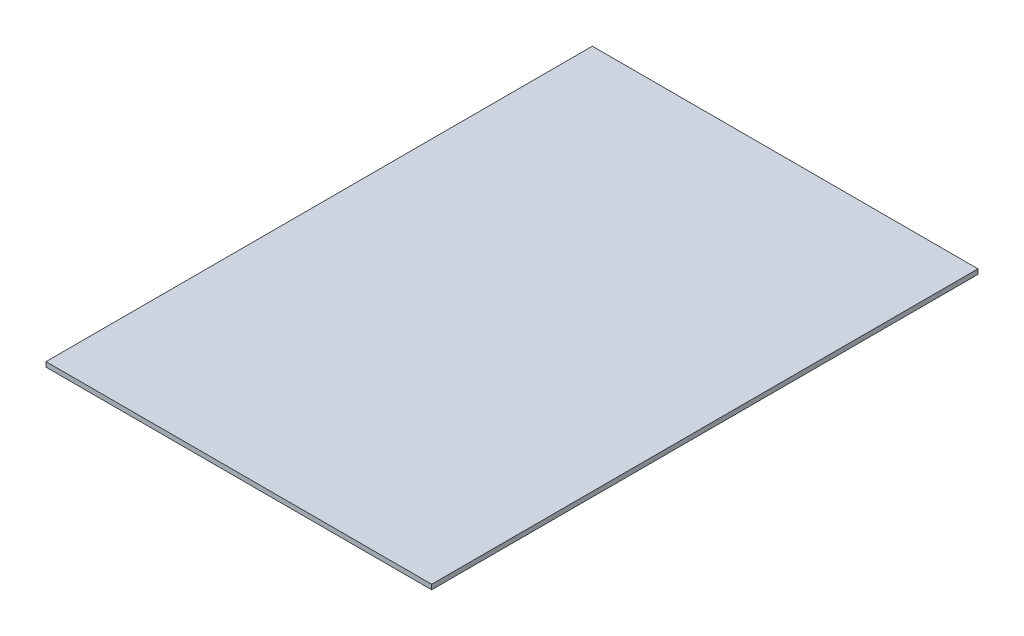
ISO-10303-21;
HEADER;
FILE_DESCRIPTION(('STEP AP214'),'2;1');
FILE_NAME('part.step','',(''),(''),'','','');
FILE_SCHEMA(('AUTOMOTIVE_DESIGN { 1 0 10303 214 1 1 1 1 }'));
ENDSEC;
DATA;
#1=APPLICATION_CONTEXT('core data for automotive mechanical design processes');
#2=APPLICATION_PROTOCOL_DEFINITION('international standard','automotive_design',2000,#1);
#3=PRODUCT_CONTEXT('',#1,'mechanical');
#4=PRODUCT('Part','Part','',(#3));
#5=PRODUCT_RELATED_PRODUCT_CATEGORY('part','',(#4));
#6=PRODUCT_DEFINITION_FORMATION('','',#4);
#7=PRODUCT_DEFINITION_CONTEXT('part definition',#1,'design');
#8=PRODUCT_DEFINITION('design','',#6,#7);
#9=PRODUCT_DEFINITION_SHAPE('','',#8);
#10=(LENGTH_UNIT() NAMED_UNIT(*) SI_UNIT(.MILLI.,.METRE.));
#11=(NAMED_UNIT(*) PLANE_ANGLE_UNIT() SI_UNIT($,.RADIAN.));
#12=(NAMED_UNIT(*) SI_UNIT($,.STERADIAN.) SOLID_ANGLE_UNIT());
#13=UNCERTAINTY_MEASURE_WITH_UNIT(LENGTH_MEASURE(1.E-05),#10,'distance_accuracy_value','');
#14=(GEOMETRIC_REPRESENTATION_CONTEXT(3) GLOBAL_UNCERTAINTY_ASSIGNED_CONTEXT((#13)) GLOBAL_UNIT_ASSIGNED_CONTEXT((#10,
#11,#12)) REPRESENTATION_CONTEXT('',''));
#15=CARTESIAN_POINT('',(0.,0.,0.));
#16=DIRECTION('',(0.,0.,1.));
#17=DIRECTION('',(1.,0.,0.));
#18=AXIS2_PLACEMENT_3D('',#15,#16,#17);
#19=CARTESIAN_POINT('',(152.4,1.905,-215.9));
#20=DIRECTION('',(-1.,0.,0.));
#21=DIRECTION('',(0.,0.,1.));
#22=AXIS2_PLACEMENT_3D('',#19,#20,#21);
#23=PLANE('',#22);
#24=DIRECTION('',(0.,0.,-1.));
#25=VECTOR('',#24,1.);
#26=CARTESIAN_POINT('',(152.4,0.,-215.9));
#27=LINE('',#26,#25);
#28=CARTESIAN_POINT('',(152.4,0.,0.));
#29=VERTEX_POINT('',#28);
#30=CARTESIAN_POINT('',(152.4,0.,-215.9));
#31=VERTEX_POINT('',#30);
#32=EDGE_CURVE('E111',#29,#31,#27,.T.);
#33=ORIENTED_EDGE('',*,*,#32,.T.);
#34=DIRECTION('',(0.,-1.,0.));
#35=VECTOR('',#34,1.);
#36=CARTESIAN_POINT('',(152.4,1.905,-215.9));
#37=LINE('',#36,#35);
#38=CARTESIAN_POINT('',(152.4,1.905,-215.9));
#39=VERTEX_POINT('',#38);
#40=EDGE_CURVE('E11',#39,#31,#37,.T.);
#41=ORIENTED_EDGE('',*,*,#40,.F.);
#42=DIRECTION('',(0.,0.,-1.));
#43=VECTOR('',#42,1.);
#44=CARTESIAN_POINT('',(152.4,1.905,-215.9));
#45=LINE('',#44,#43);
#46=CARTESIAN_POINT('',(152.4,1.905,0.));
#47=VERTEX_POINT('',#46);
#48=EDGE_CURVE('E95',#47,#39,#45,.T.);
#49=ORIENTED_EDGE('',*,*,#48,.F.);
#50=DIRECTION('',(0.,-1.,0.));
#51=VECTOR('',#50,1.);
#52=CARTESIAN_POINT('',(152.4,1.905,0.));
#53=LINE('',#52,#51);
#54=EDGE_CURVE('E107',#47,#29,#53,.T.);
#55=ORIENTED_EDGE('',*,*,#54,.T.);
#56=EDGE_LOOP('',(#33,#41,#49,#55));
#57=FACE_BOUND('',#56,.T.);
#58=ADVANCED_FACE('F43',(#57),#23,.F.);
#59=CARTESIAN_POINT('',(152.4,1.905,-215.9));
#60=DIRECTION('',(0.,0.,1.));
#61=DIRECTION('',(1.,0.,0.));
#62=AXIS2_PLACEMENT_3D('',#59,#60,#61);
#63=PLANE('',#62);
#64=DIRECTION('',(-1.,0.,0.));
#65=VECTOR('',#64,1.);
#66=CARTESIAN_POINT('',(152.4,0.,-215.9));
#67=LINE('',#66,#65);
#68=CARTESIAN_POINT('',(0.,0.,-215.9));
#69=VERTEX_POINT('',#68);
#70=EDGE_CURVE('E100',#31,#69,#67,.T.);
#71=ORIENTED_EDGE('',*,*,#70,.T.);
#72=DIRECTION('',(0.,-1.,0.));
#73=VECTOR('',#72,1.);
#74=CARTESIAN_POINT('',(0.,1.905,-215.9));
#75=LINE('',#74,#73);
#76=CARTESIAN_POINT('',(0.,1.905,-215.9));
#77=VERTEX_POINT('',#76);
#78=EDGE_CURVE('E52',#77,#69,#75,.T.);
#79=ORIENTED_EDGE('',*,*,#78,.F.);
#80=DIRECTION('',(-1.,0.,0.));
#81=VECTOR('',#80,1.);
#82=CARTESIAN_POINT('',(152.4,1.905,-215.9));
#83=LINE('',#82,#81);
#84=EDGE_CURVE('E90',#39,#77,#83,.T.);
#85=ORIENTED_EDGE('',*,*,#84,.F.);
#86=ORIENTED_EDGE('',*,*,#40,.T.);
#87=EDGE_LOOP('',(#71,#79,#85,#86));
#88=FACE_BOUND('',#87,.T.);
#89=ADVANCED_FACE('F99',(#88),#63,.F.);
#90=CARTESIAN_POINT('',(0.,1.905,-215.9));
#91=DIRECTION('',(1.,0.,0.));
#92=DIRECTION('',(0.,0.,-1.));
#93=AXIS2_PLACEMENT_3D('',#90,#91,#92);
#94=PLANE('',#93);
#95=DIRECTION('',(0.,0.,1.));
#96=VECTOR('',#95,1.);
#97=CARTESIAN_POINT('',(0.,0.,-215.9));
#98=LINE('',#97,#96);
#99=CARTESIAN_POINT('',(0.,0.,0.));
#100=VERTEX_POINT('',#99);
#101=EDGE_CURVE('E77',#69,#100,#98,.T.);
#102=ORIENTED_EDGE('',*,*,#101,.T.);
#103=DIRECTION('',(0.,-1.,0.));
#104=VECTOR('',#103,1.);
#105=CARTESIAN_POINT('',(0.,1.905,0.));
#106=LINE('',#105,#104);
#107=CARTESIAN_POINT('',(0.,1.905,0.));
#108=VERTEX_POINT('',#107);
#109=EDGE_CURVE('E102',#108,#100,#106,.T.);
#110=ORIENTED_EDGE('',*,*,#109,.F.);
#111=DIRECTION('',(0.,0.,1.));
#112=VECTOR('',#111,1.);
#113=CARTESIAN_POINT('',(0.,1.905,-215.9));
#114=LINE('',#113,#112);
#115=EDGE_CURVE('E93',#77,#108,#114,.T.);
#116=ORIENTED_EDGE('',*,*,#115,.F.);
#117=ORIENTED_EDGE('',*,*,#78,.T.);
#118=EDGE_LOOP('',(#102,#110,#116,#117));
#119=FACE_BOUND('',#118,.T.);
#120=ADVANCED_FACE('F103',(#119),#94,.F.);
#121=CARTESIAN_POINT('',(152.4,1.905,0.));
#122=DIRECTION('',(0.,0.,-1.));
#123=DIRECTION('',(-1.,0.,0.));
#124=AXIS2_PLACEMENT_3D('',#121,#122,#123);
#125=PLANE('',#124);
#126=DIRECTION('',(1.,0.,0.));
#127=VECTOR('',#126,1.);
#128=CARTESIAN_POINT('',(152.4,0.,0.));
#129=LINE('',#128,#127);
#130=EDGE_CURVE('E83',#100,#29,#129,.T.);
#131=ORIENTED_EDGE('',*,*,#130,.T.);
#132=ORIENTED_EDGE('',*,*,#54,.F.);
#133=DIRECTION('',(1.,0.,0.));
#134=VECTOR('',#133,1.);
#135=CARTESIAN_POINT('',(152.4,1.905,0.));
#136=LINE('',#135,#134);
#137=EDGE_CURVE('E60',#108,#47,#136,.T.);
#138=ORIENTED_EDGE('',*,*,#137,.F.);
#139=ORIENTED_EDGE('',*,*,#109,.T.);
#140=EDGE_LOOP('',(#131,#132,#138,#139));
#141=FACE_BOUND('',#140,.T.);
#142=ADVANCED_FACE('F124',(#141),#125,.F.);
#143=CARTESIAN_POINT('',(0.,1.905,0.));
#144=DIRECTION('',(0.,-1.,0.));
#145=DIRECTION('',(0.,0.,-1.));
#146=AXIS2_PLACEMENT_3D('',#143,#144,#145);
#147=PLANE('',#146);
#148=ORIENTED_EDGE('',*,*,#48,.T.);
#149=ORIENTED_EDGE('',*,*,#84,.T.);
#150=ORIENTED_EDGE('',*,*,#115,.T.);
#151=ORIENTED_EDGE('',*,*,#137,.T.);
#152=EDGE_LOOP('',(#148,#149,#150,#151));
#153=FACE_BOUND('',#152,.T.);
#154=ADVANCED_FACE('F91',(#153),#147,.F.);
#155=CARTESIAN_POINT('',(0.,0.,0.));
#156=DIRECTION('',(0.,-1.,0.));
#157=DIRECTION('',(0.,0.,-1.));
#158=AXIS2_PLACEMENT_3D('',#155,#156,#157);
#159=PLANE('',#158);
#160=ORIENTED_EDGE('',*,*,#32,.F.);
#161=ORIENTED_EDGE('',*,*,#130,.F.);
#162=ORIENTED_EDGE('',*,*,#101,.F.);
#163=ORIENTED_EDGE('',*,*,#70,.F.);
#164=EDGE_LOOP('',(#160,#161,#162,#163));
#165=FACE_BOUND('',#164,.T.);
#166=ADVANCED_FACE('F127',(#165),#159,.T.);
#167=CLOSED_SHELL('',(#58,#89,#120,#142,#154,#166));
#168=MANIFOLD_SOLID_BREP('B2',#167);
#169=ADVANCED_BREP_SHAPE_REPRESENTATION('',(#18,#168),#14);
#170=SHAPE_DEFINITION_REPRESENTATION(#9,#169);
ENDSEC;
END-ISO-10303-21;
